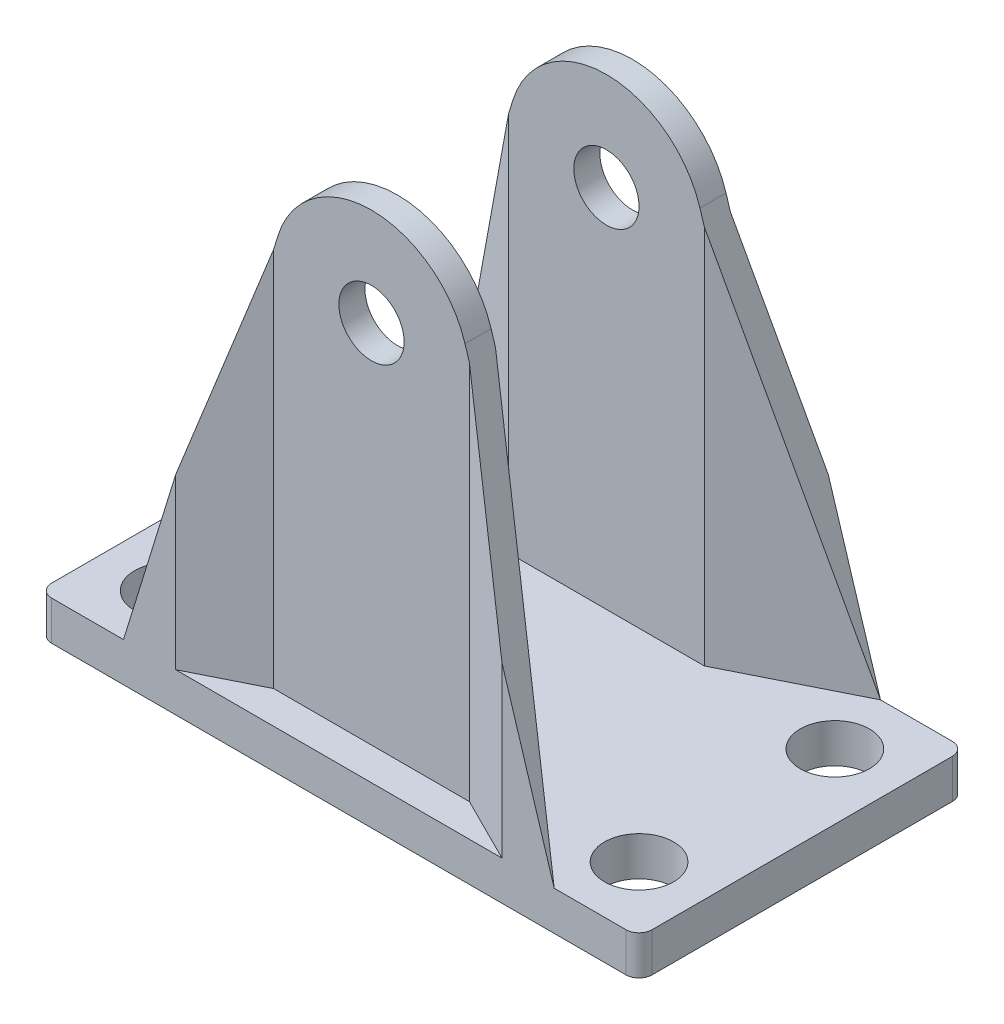
ISO-10303-21;
HEADER;
FILE_DESCRIPTION(('STEP AP214'),'2;1');
FILE_NAME('part.step','',(''),(''),'','','');
FILE_SCHEMA(('AUTOMOTIVE_DESIGN { 1 0 10303 214 1 1 1 1 }'));
ENDSEC;
DATA;
#1=APPLICATION_CONTEXT('core data for automotive mechanical design processes');
#2=APPLICATION_PROTOCOL_DEFINITION('international standard','automotive_design',2000,#1);
#3=PRODUCT_CONTEXT('',#1,'mechanical');
#4=PRODUCT('Part','Part','',(#3));
#5=PRODUCT_RELATED_PRODUCT_CATEGORY('part','',(#4));
#6=PRODUCT_DEFINITION_FORMATION('','',#4);
#7=PRODUCT_DEFINITION_CONTEXT('part definition',#1,'design');
#8=PRODUCT_DEFINITION('design','',#6,#7);
#9=PRODUCT_DEFINITION_SHAPE('','',#8);
#10=(LENGTH_UNIT() NAMED_UNIT(*) SI_UNIT(.MILLI.,.METRE.));
#11=(NAMED_UNIT(*) PLANE_ANGLE_UNIT() SI_UNIT($,.RADIAN.));
#12=(NAMED_UNIT(*) SI_UNIT($,.STERADIAN.) SOLID_ANGLE_UNIT());
#13=UNCERTAINTY_MEASURE_WITH_UNIT(LENGTH_MEASURE(1.E-05),#10,'distance_accuracy_value','');
#14=(GEOMETRIC_REPRESENTATION_CONTEXT(3) GLOBAL_UNCERTAINTY_ASSIGNED_CONTEXT((#13)) GLOBAL_UNIT_ASSIGNED_CONTEXT((#10,
#11,#12)) REPRESENTATION_CONTEXT('',''));
#15=CARTESIAN_POINT('',(0.,0.,0.));
#16=DIRECTION('',(0.,0.,1.));
#17=DIRECTION('',(1.,0.,0.));
#18=AXIS2_PLACEMENT_3D('',#15,#16,#17);
#19=CARTESIAN_POINT('',(-23.,1.5,-12.5));
#20=DIRECTION('',(0.,0.,1.));
#21=DIRECTION('',(1.,0.,0.));
#22=AXIS2_PLACEMENT_3D('',#19,#20,#21);
#23=PLANE('',#22);
#24=DIRECTION('',(-0.295172368215651,0.955444018790198,0.));
#25=VECTOR('',#24,1.);
#26=CARTESIAN_POINT('',(13.0584942851576,12.6398166120894,-12.5));
#27=LINE('',#26,#25);
#28=CARTESIAN_POINT('',(16.5,1.5,-12.5));
#29=VERTEX_POINT('',#28);
#30=CARTESIAN_POINT('',(12.5,14.4476078613449,-12.5));
#31=VERTEX_POINT('',#30);
#32=EDGE_CURVE('E438',#29,#31,#27,.T.);
#33=ORIENTED_EDGE('',*,*,#32,.F.);
#34=DIRECTION('',(-1.,0.,0.));
#35=VECTOR('',#34,1.);
#36=CARTESIAN_POINT('',(-23.,1.5,-12.5));
#37=LINE('',#36,#35);
#38=CARTESIAN_POINT('',(22.,1.5,-12.5));
#39=VERTEX_POINT('',#38);
#40=EDGE_CURVE('E263',#39,#29,#37,.T.);
#41=ORIENTED_EDGE('',*,*,#40,.F.);
#42=DIRECTION('',(0.,-1.,0.));
#43=VECTOR('',#42,1.);
#44=CARTESIAN_POINT('',(22.,1.5,-12.5));
#45=LINE('',#44,#43);
#46=CARTESIAN_POINT('',(22.,-1.5,-12.5));
#47=VERTEX_POINT('',#46);
#48=EDGE_CURVE('E348',#39,#47,#45,.T.);
#49=ORIENTED_EDGE('',*,*,#48,.T.);
#50=DIRECTION('',(-1.,0.,0.));
#51=VECTOR('',#50,1.);
#52=CARTESIAN_POINT('',(-23.,-1.5,-12.5));
#53=LINE('',#52,#51);
#54=CARTESIAN_POINT('',(-22.,-1.5,-12.5));
#55=VERTEX_POINT('',#54);
#56=EDGE_CURVE('E292',#47,#55,#53,.T.);
#57=ORIENTED_EDGE('',*,*,#56,.T.);
#58=DIRECTION('',(0.,-1.,0.));
#59=VECTOR('',#58,1.);
#60=CARTESIAN_POINT('',(-22.,1.5,-12.5));
#61=LINE('',#60,#59);
#62=CARTESIAN_POINT('',(-22.,1.5,-12.5));
#63=VERTEX_POINT('',#62);
#64=EDGE_CURVE('E257',#55,#63,#61,.F.);
#65=ORIENTED_EDGE('',*,*,#64,.T.);
#66=CARTESIAN_POINT('',(-16.5,1.5,-12.5));
#67=VERTEX_POINT('',#66);
#68=EDGE_CURVE('E246',#67,#63,#37,.T.);
#69=ORIENTED_EDGE('',*,*,#68,.F.);
#70=DIRECTION('',(0.295172368215653,0.955444018790197,0.));
#71=VECTOR('',#70,1.);
#72=CARTESIAN_POINT('',(-17.0663237252272,-0.333134379204587,-12.5));
#73=LINE('',#72,#71);
#74=CARTESIAN_POINT('',(-12.5,14.447607861345,-12.5));
#75=VERTEX_POINT('',#74);
#76=EDGE_CURVE('E221',#67,#75,#73,.T.);
#77=ORIENTED_EDGE('',*,*,#76,.T.);
#78=DIRECTION('',(0.,-1.,0.));
#79=VECTOR('',#78,1.);
#80=CARTESIAN_POINT('',(-12.5,51.5,-12.5));
#81=LINE('',#80,#79);
#82=CARTESIAN_POINT('',(-12.5,1.5,-12.5));
#83=VERTEX_POINT('',#82);
#84=EDGE_CURVE('E505',#75,#83,#81,.T.);
#85=ORIENTED_EDGE('',*,*,#84,.T.);
#86=CARTESIAN_POINT('',(12.5,1.5,-12.5));
#87=VERTEX_POINT('',#86);
#88=EDGE_CURVE('E260',#87,#83,#37,.T.);
#89=ORIENTED_EDGE('',*,*,#88,.F.);
#90=DIRECTION('',(0.,-1.,0.));
#91=VECTOR('',#90,1.);
#92=CARTESIAN_POINT('',(12.5,51.5,-12.5));
#93=LINE('',#92,#91);
#94=EDGE_CURVE('E514',#31,#87,#93,.T.);
#95=ORIENTED_EDGE('',*,*,#94,.F.);
#96=EDGE_LOOP('',(#33,#41,#49,#57,#65,#69,#77,#85,#89,#95));
#97=FACE_BOUND('',#96,.T.);
#98=ADVANCED_FACE('F47',(#97),#23,.F.);
#99=CARTESIAN_POINT('',(-23.,1.5,12.5));
#100=DIRECTION('',(0.,0.,-1.));
#101=DIRECTION('',(-1.,0.,0.));
#102=AXIS2_PLACEMENT_3D('',#99,#100,#101);
#103=PLANE('',#102);
#104=DIRECTION('',(0.295172368215651,-0.955444018790198,0.));
#105=VECTOR('',#104,1.);
#106=CARTESIAN_POINT('',(13.0584942851576,12.6398166120894,12.5));
#107=LINE('',#106,#105);
#108=CARTESIAN_POINT('',(12.5,14.447607861345,12.5));
#109=VERTEX_POINT('',#108);
#110=CARTESIAN_POINT('',(16.5,1.5,12.5));
#111=VERTEX_POINT('',#110);
#112=EDGE_CURVE('E421',#109,#111,#107,.T.);
#113=ORIENTED_EDGE('',*,*,#112,.F.);
#114=DIRECTION('',(0.,-1.,0.));
#115=VECTOR('',#114,1.);
#116=CARTESIAN_POINT('',(12.5,51.5,12.5));
#117=LINE('',#116,#115);
#118=CARTESIAN_POINT('',(12.5,1.5,12.5));
#119=VERTEX_POINT('',#118);
#120=EDGE_CURVE('E477',#109,#119,#117,.T.);
#121=ORIENTED_EDGE('',*,*,#120,.T.);
#122=DIRECTION('',(1.,0.,0.));
#123=VECTOR('',#122,1.);
#124=CARTESIAN_POINT('',(-23.,1.5,12.5));
#125=LINE('',#124,#123);
#126=CARTESIAN_POINT('',(-12.5,1.5,12.5));
#127=VERTEX_POINT('',#126);
#128=EDGE_CURVE('E282',#127,#119,#125,.T.);
#129=ORIENTED_EDGE('',*,*,#128,.F.);
#130=DIRECTION('',(0.,-1.,0.));
#131=VECTOR('',#130,1.);
#132=CARTESIAN_POINT('',(-12.5,51.5,12.5));
#133=LINE('',#132,#131);
#134=CARTESIAN_POINT('',(-12.5,14.447607861345,12.5));
#135=VERTEX_POINT('',#134);
#136=EDGE_CURVE('E252',#135,#127,#133,.T.);
#137=ORIENTED_EDGE('',*,*,#136,.F.);
#138=DIRECTION('',(-0.295172368215653,-0.955444018790197,0.));
#139=VECTOR('',#138,1.);
#140=CARTESIAN_POINT('',(-17.0663237252272,-0.333134379204587,12.5));
#141=LINE('',#140,#139);
#142=CARTESIAN_POINT('',(-16.5,1.5,12.5));
#143=VERTEX_POINT('',#142);
#144=EDGE_CURVE('E391',#135,#143,#141,.T.);
#145=ORIENTED_EDGE('',*,*,#144,.T.);
#146=CARTESIAN_POINT('',(-22.,1.5,12.5));
#147=VERTEX_POINT('',#146);
#148=EDGE_CURVE('E284',#147,#143,#125,.T.);
#149=ORIENTED_EDGE('',*,*,#148,.F.);
#150=DIRECTION('',(0.,-1.,0.));
#151=VECTOR('',#150,1.);
#152=CARTESIAN_POINT('',(-22.,1.5,12.5));
#153=LINE('',#152,#151);
#154=CARTESIAN_POINT('',(-22.,-1.5,12.5));
#155=VERTEX_POINT('',#154);
#156=EDGE_CURVE('E321',#147,#155,#153,.T.);
#157=ORIENTED_EDGE('',*,*,#156,.T.);
#158=DIRECTION('',(1.,0.,0.));
#159=VECTOR('',#158,1.);
#160=CARTESIAN_POINT('',(-23.,-1.5,12.5));
#161=LINE('',#160,#159);
#162=CARTESIAN_POINT('',(22.,-1.5,12.5));
#163=VERTEX_POINT('',#162);
#164=EDGE_CURVE('E268',#155,#163,#161,.T.);
#165=ORIENTED_EDGE('',*,*,#164,.T.);
#166=DIRECTION('',(0.,-1.,0.));
#167=VECTOR('',#166,1.);
#168=CARTESIAN_POINT('',(22.,1.5,12.5));
#169=LINE('',#168,#167);
#170=CARTESIAN_POINT('',(22.,1.5,12.5));
#171=VERTEX_POINT('',#170);
#172=EDGE_CURVE('E325',#163,#171,#169,.F.);
#173=ORIENTED_EDGE('',*,*,#172,.T.);
#174=EDGE_CURVE('E278',#111,#171,#125,.T.);
#175=ORIENTED_EDGE('',*,*,#174,.F.);
#176=EDGE_LOOP('',(#113,#121,#129,#137,#145,#149,#157,#165,#173,#175));
#177=FACE_BOUND('',#176,.T.);
#178=ADVANCED_FACE('F576',(#177),#103,.F.);
#179=CARTESIAN_POINT('',(0.,51.5,-8.));
#180=DIRECTION('',(0.,0.,-1.));
#181=DIRECTION('',(-1.,0.,0.));
#182=AXIS2_PLACEMENT_3D('',#179,#180,#181);
#183=PLANE('',#182);
#184=CARTESIAN_POINT('',(0.,29.5,-8.));
#185=DIRECTION('',(0.,0.,-1.));
#186=DIRECTION('',(-1.,0.,0.));
#187=AXIS2_PLACEMENT_3D('',#184,#185,#186);
#188=CIRCLE('',#187,2.5);
#189=CARTESIAN_POINT('',(-2.5,29.5,-8.));
#190=VERTEX_POINT('',#189);
#191=EDGE_CURVE('E384',#190,#190,#188,.T.);
#192=ORIENTED_EDGE('',*,*,#191,.T.);
#193=EDGE_LOOP('',(#192));
#194=FACE_BOUND('',#193,.T.);
#195=DIRECTION('',(0.295172368215651,-0.955444018790198,0.));
#196=VECTOR('',#195,1.);
#197=CARTESIAN_POINT('',(0.96137531900328,51.7970047685406,-8.));
#198=LINE('',#197,#196);
#199=CARTESIAN_POINT('',(7.16583014092648,31.7137927616174,-8.));
#200=VERTEX_POINT('',#199);
#201=CARTESIAN_POINT('',(7.5,30.6321176880262,-8.));
#202=VERTEX_POINT('',#201);
#203=EDGE_CURVE('E444',#200,#202,#198,.T.);
#204=ORIENTED_EDGE('',*,*,#203,.F.);
#205=CARTESIAN_POINT('',(0.,29.5,-8.));
#206=DIRECTION('',(0.,0.,-1.));
#207=DIRECTION('',(-1.,0.,0.));
#208=AXIS2_PLACEMENT_3D('',#205,#206,#207);
#209=CIRCLE('',#208,7.5);
#210=CARTESIAN_POINT('',(-7.16583014092648,31.7137927616174,-8.));
#211=VERTEX_POINT('',#210);
#212=EDGE_CURVE('E414',#211,#200,#209,.T.);
#213=ORIENTED_EDGE('',*,*,#212,.F.);
#214=DIRECTION('',(-0.295172368215653,-0.955444018790197,0.));
#215=VECTOR('',#214,1.);
#216=CARTESIAN_POINT('',(-0.96137531900325,51.7970047685406,-8.));
#217=LINE('',#216,#215);
#218=CARTESIAN_POINT('',(-7.5,30.6321176880262,-8.));
#219=VERTEX_POINT('',#218);
#220=EDGE_CURVE('E240',#211,#219,#217,.T.);
#221=ORIENTED_EDGE('',*,*,#220,.T.);
#222=DIRECTION('',(0.,-1.,0.));
#223=VECTOR('',#222,1.);
#224=CARTESIAN_POINT('',(-7.5,51.5,-8.));
#225=LINE('',#224,#223);
#226=CARTESIAN_POINT('',(-7.5,1.5,-8.));
#227=VERTEX_POINT('',#226);
#228=EDGE_CURVE('E238',#219,#227,#225,.T.);
#229=ORIENTED_EDGE('',*,*,#228,.T.);
#230=DIRECTION('',(1.,0.,0.));
#231=VECTOR('',#230,1.);
#232=CARTESIAN_POINT('',(0.,1.5,-8.));
#233=LINE('',#232,#231);
#234=CARTESIAN_POINT('',(7.5,1.5,-8.));
#235=VERTEX_POINT('',#234);
#236=EDGE_CURVE('E250',#227,#235,#233,.T.);
#237=ORIENTED_EDGE('',*,*,#236,.T.);
#238=DIRECTION('',(0.,-1.,0.));
#239=VECTOR('',#238,1.);
#240=CARTESIAN_POINT('',(7.5,51.5,-8.));
#241=LINE('',#240,#239);
#242=EDGE_CURVE('E517',#202,#235,#241,.T.);
#243=ORIENTED_EDGE('',*,*,#242,.F.);
#244=EDGE_LOOP('',(#204,#213,#221,#229,#237,#243));
#245=FACE_BOUND('',#244,.T.);
#246=ADVANCED_FACE('F582',(#194,#245),#183,.F.);
#247=CARTESIAN_POINT('',(-1.7,51.5,-3.4));
#248=DIRECTION('',(-0.447213595499958,0.,-0.894427190999916));
#249=DIRECTION('',(-0.894427190999916,0.,0.447213595499958));
#250=AXIS2_PLACEMENT_3D('',#247,#248,#249);
#251=PLANE('',#250);
#252=DIRECTION('',(0.292009273283408,-0.945205390587474,-0.146004636641704));
#253=VECTOR('',#252,1.);
#254=CARTESIAN_POINT('',(0.759683832749848,52.4498603367859,-4.62984191637492));
#255=LINE('',#254,#253);
#256=EDGE_CURVE('E441',#202,#29,#255,.T.);
#257=ORIENTED_EDGE('',*,*,#256,.F.);
#258=ORIENTED_EDGE('',*,*,#242,.T.);
#259=DIRECTION('',(0.894427190999916,0.,-0.447213595499958));
#260=VECTOR('',#259,1.);
#261=CARTESIAN_POINT('',(-1.7,1.5,-3.4));
#262=LINE('',#261,#260);
#263=EDGE_CURVE('E490',#235,#29,#262,.T.);
#264=ORIENTED_EDGE('',*,*,#263,.T.);
#265=EDGE_LOOP('',(#257,#258,#264));
#266=FACE_BOUND('',#265,.T.);
#267=ADVANCED_FACE('F635',(#266),#251,.F.);
#268=CARTESIAN_POINT('',(-2.5,51.5,-5.));
#269=DIRECTION('',(-0.447213595499958,0.,-0.894427190999916));
#270=DIRECTION('',(-0.894427190999916,0.,0.447213595499958));
#271=AXIS2_PLACEMENT_3D('',#268,#269,#270);
#272=PLANE('',#271);
#273=DIRECTION('',(0.,-1.,0.));
#274=VECTOR('',#273,1.);
#275=CARTESIAN_POINT('',(7.5,51.5,-10.));
#276=LINE('',#275,#274);
#277=CARTESIAN_POINT('',(7.5,30.6321176880262,-10.));
#278=VERTEX_POINT('',#277);
#279=CARTESIAN_POINT('',(7.5,1.5,-10.));
#280=VERTEX_POINT('',#279);
#281=EDGE_CURVE('E511',#278,#280,#276,.T.);
#282=ORIENTED_EDGE('',*,*,#281,.F.);
#283=DIRECTION('',(0.292009273283408,-0.945205390587474,-0.146004636641704));
#284=VECTOR('',#283,1.);
#285=CARTESIAN_POINT('',(0.674414417066342,52.7258690759949,-6.58720720853317));
#286=LINE('',#285,#284);
#287=EDGE_CURVE('E434',#278,#31,#286,.T.);
#288=ORIENTED_EDGE('',*,*,#287,.T.);
#289=ORIENTED_EDGE('',*,*,#94,.T.);
#290=DIRECTION('',(0.894427190999916,0.,-0.447213595499958));
#291=VECTOR('',#290,1.);
#292=CARTESIAN_POINT('',(-2.5,1.5,-5.));
#293=LINE('',#292,#291);
#294=EDGE_CURVE('E493',#280,#87,#293,.T.);
#295=ORIENTED_EDGE('',*,*,#294,.F.);
#296=EDGE_LOOP('',(#282,#288,#289,#295));
#297=FACE_BOUND('',#296,.T.);
#298=ADVANCED_FACE('F616',(#297),#272,.T.);
#299=CARTESIAN_POINT('',(0.,51.5,-10.));
#300=DIRECTION('',(0.,0.,-1.));
#301=DIRECTION('',(-1.,0.,0.));
#302=AXIS2_PLACEMENT_3D('',#299,#300,#301);
#303=PLANE('',#302);
#304=CARTESIAN_POINT('',(0.,29.5,-10.));
#305=DIRECTION('',(0.,0.,-1.));
#306=DIRECTION('',(-1.,0.,0.));
#307=AXIS2_PLACEMENT_3D('',#304,#305,#306);
#308=CIRCLE('',#307,2.5);
#309=CARTESIAN_POINT('',(-2.5,29.5,-10.));
#310=VERTEX_POINT('',#309);
#311=EDGE_CURVE('E723',#310,#310,#308,.T.);
#312=ORIENTED_EDGE('',*,*,#311,.F.);
#313=EDGE_LOOP('',(#312));
#314=FACE_BOUND('',#313,.T.);
#315=CARTESIAN_POINT('',(0.,29.5,-10.));
#316=DIRECTION('',(0.,0.,-1.));
#317=DIRECTION('',(-1.,0.,0.));
#318=AXIS2_PLACEMENT_3D('',#315,#316,#317);
#319=CIRCLE('',#318,7.5);
#320=CARTESIAN_POINT('',(-7.16583014092648,31.7137927616174,-10.));
#321=VERTEX_POINT('',#320);
#322=CARTESIAN_POINT('',(7.16583014092648,31.7137927616174,-10.));
#323=VERTEX_POINT('',#322);
#324=EDGE_CURVE('E410',#321,#323,#319,.T.);
#325=ORIENTED_EDGE('',*,*,#324,.T.);
#326=DIRECTION('',(0.295172368215651,-0.955444018790198,0.));
#327=VECTOR('',#326,1.);
#328=CARTESIAN_POINT('',(0.96137531900328,51.7970047685406,-10.));
#329=LINE('',#328,#327);
#330=EDGE_CURVE('E430',#323,#278,#329,.T.);
#331=ORIENTED_EDGE('',*,*,#330,.T.);
#332=ORIENTED_EDGE('',*,*,#281,.T.);
#333=DIRECTION('',(1.,0.,0.));
#334=VECTOR('',#333,1.);
#335=CARTESIAN_POINT('',(0.,1.5,-10.));
#336=LINE('',#335,#334);
#337=CARTESIAN_POINT('',(-7.5,1.5,-10.));
#338=VERTEX_POINT('',#337);
#339=EDGE_CURVE('E497',#338,#280,#336,.T.);
#340=ORIENTED_EDGE('',*,*,#339,.F.);
#341=DIRECTION('',(0.,-1.,0.));
#342=VECTOR('',#341,1.);
#343=CARTESIAN_POINT('',(-7.5,51.5,-10.));
#344=LINE('',#343,#342);
#345=CARTESIAN_POINT('',(-7.5,30.6321176880262,-10.));
#346=VERTEX_POINT('',#345);
#347=EDGE_CURVE('E508',#346,#338,#344,.T.);
#348=ORIENTED_EDGE('',*,*,#347,.F.);
#349=DIRECTION('',(-0.295172368215653,-0.955444018790197,0.));
#350=VECTOR('',#349,1.);
#351=CARTESIAN_POINT('',(-0.96137531900325,51.7970047685406,-10.));
#352=LINE('',#351,#350);
#353=EDGE_CURVE('E64',#321,#346,#352,.T.);
#354=ORIENTED_EDGE('',*,*,#353,.F.);
#355=EDGE_LOOP('',(#325,#331,#332,#340,#348,#354));
#356=FACE_BOUND('',#355,.T.);
#357=ADVANCED_FACE('F620',(#314,#356),#303,.T.);
#358=CARTESIAN_POINT('',(0.,51.5,10.));
#359=DIRECTION('',(0.,0.,-1.));
#360=DIRECTION('',(-1.,0.,0.));
#361=AXIS2_PLACEMENT_3D('',#358,#359,#360);
#362=PLANE('',#361);
#363=CARTESIAN_POINT('',(0.,29.5,10.));
#364=DIRECTION('',(0.,0.,-1.));
#365=DIRECTION('',(-1.,0.,0.));
#366=AXIS2_PLACEMENT_3D('',#363,#364,#365);
#367=CIRCLE('',#366,2.5);
#368=CARTESIAN_POINT('',(-2.5,29.5,10.));
#369=VERTEX_POINT('',#368);
#370=EDGE_CURVE('E726',#369,#369,#367,.T.);
#371=ORIENTED_EDGE('',*,*,#370,.T.);
#372=EDGE_LOOP('',(#371));
#373=FACE_BOUND('',#372,.T.);
#374=DIRECTION('',(0.295172368215651,-0.955444018790198,0.));
#375=VECTOR('',#374,1.);
#376=CARTESIAN_POINT('',(0.96137531900328,51.7970047685406,10.));
#377=LINE('',#376,#375);
#378=CARTESIAN_POINT('',(7.16583014092648,31.7137927616174,10.));
#379=VERTEX_POINT('',#378);
#380=CARTESIAN_POINT('',(7.5,30.6321176880262,10.));
#381=VERTEX_POINT('',#380);
#382=EDGE_CURVE('E427',#379,#381,#377,.T.);
#383=ORIENTED_EDGE('',*,*,#382,.F.);
#384=CARTESIAN_POINT('',(0.,29.5,10.));
#385=DIRECTION('',(0.,0.,-1.));
#386=DIRECTION('',(-1.,0.,0.));
#387=AXIS2_PLACEMENT_3D('',#384,#385,#386);
#388=CIRCLE('',#387,7.5);
#389=CARTESIAN_POINT('',(-7.16583014092648,31.7137927616174,10.));
#390=VERTEX_POINT('',#389);
#391=EDGE_CURVE('E370',#390,#379,#388,.T.);
#392=ORIENTED_EDGE('',*,*,#391,.F.);
#393=DIRECTION('',(-0.295172368215653,-0.955444018790197,0.));
#394=VECTOR('',#393,1.);
#395=CARTESIAN_POINT('',(-0.96137531900325,51.7970047685406,10.));
#396=LINE('',#395,#394);
#397=CARTESIAN_POINT('',(-7.5,30.6321176880262,10.));
#398=VERTEX_POINT('',#397);
#399=EDGE_CURVE('E398',#390,#398,#396,.T.);
#400=ORIENTED_EDGE('',*,*,#399,.T.);
#401=DIRECTION('',(0.,-1.,0.));
#402=VECTOR('',#401,1.);
#403=CARTESIAN_POINT('',(-7.5,51.5,10.));
#404=LINE('',#403,#402);
#405=CARTESIAN_POINT('',(-7.5,1.5,10.));
#406=VERTEX_POINT('',#405);
#407=EDGE_CURVE('E483',#398,#406,#404,.T.);
#408=ORIENTED_EDGE('',*,*,#407,.T.);
#409=DIRECTION('',(1.,0.,0.));
#410=VECTOR('',#409,1.);
#411=CARTESIAN_POINT('',(0.,1.5,10.));
#412=LINE('',#411,#410);
#413=CARTESIAN_POINT('',(7.5,1.5,10.));
#414=VERTEX_POINT('',#413);
#415=EDGE_CURVE('E455',#406,#414,#412,.T.);
#416=ORIENTED_EDGE('',*,*,#415,.T.);
#417=DIRECTION('',(0.,-1.,0.));
#418=VECTOR('',#417,1.);
#419=CARTESIAN_POINT('',(7.5,51.5,10.));
#420=LINE('',#419,#418);
#421=EDGE_CURVE('E480',#381,#414,#420,.T.);
#422=ORIENTED_EDGE('',*,*,#421,.F.);
#423=EDGE_LOOP('',(#383,#392,#400,#408,#416,#422));
#424=FACE_BOUND('',#423,.T.);
#425=ADVANCED_FACE('F703',(#373,#424),#362,.F.);
#426=CARTESIAN_POINT('',(-2.5,51.5,5.));
#427=DIRECTION('',(0.447213595499958,0.,-0.894427190999916));
#428=DIRECTION('',(-0.894427190999916,0.,-0.447213595499958));
#429=AXIS2_PLACEMENT_3D('',#426,#427,#428);
#430=PLANE('',#429);
#431=DIRECTION('',(0.292009273283408,-0.945205390587474,0.146004636641704));
#432=VECTOR('',#431,1.);
#433=CARTESIAN_POINT('',(0.674414417066342,52.7258690759949,6.58720720853317));
#434=LINE('',#433,#432);
#435=EDGE_CURVE('E424',#381,#109,#434,.T.);
#436=ORIENTED_EDGE('',*,*,#435,.F.);
#437=ORIENTED_EDGE('',*,*,#421,.T.);
#438=DIRECTION('',(0.894427190999916,0.,0.447213595499958));
#439=VECTOR('',#438,1.);
#440=CARTESIAN_POINT('',(-2.5,1.5,5.));
#441=LINE('',#440,#439);
#442=EDGE_CURVE('E459',#414,#119,#441,.T.);
#443=ORIENTED_EDGE('',*,*,#442,.T.);
#444=ORIENTED_EDGE('',*,*,#120,.F.);
#445=EDGE_LOOP('',(#436,#437,#443,#444));
#446=FACE_BOUND('',#445,.T.);
#447=ADVANCED_FACE('F694',(#446),#430,.F.);
#448=CARTESIAN_POINT('',(-1.7,51.5,3.4));
#449=DIRECTION('',(0.447213595499958,0.,-0.894427190999916));
#450=DIRECTION('',(-0.894427190999916,0.,-0.447213595499958));
#451=AXIS2_PLACEMENT_3D('',#448,#449,#450);
#452=PLANE('',#451);
#453=DIRECTION('',(0.,-1.,0.));
#454=VECTOR('',#453,1.);
#455=CARTESIAN_POINT('',(7.5,51.5,8.));
#456=LINE('',#455,#454);
#457=CARTESIAN_POINT('',(7.5,30.6321176880262,8.));
#458=VERTEX_POINT('',#457);
#459=CARTESIAN_POINT('',(7.5,1.5,8.));
#460=VERTEX_POINT('',#459);
#461=EDGE_CURVE('E474',#458,#460,#456,.T.);
#462=ORIENTED_EDGE('',*,*,#461,.F.);
#463=DIRECTION('',(0.292009273283408,-0.945205390587474,0.146004636641704));
#464=VECTOR('',#463,1.);
#465=CARTESIAN_POINT('',(0.759683832749848,52.4498603367859,4.62984191637492));
#466=LINE('',#465,#464);
#467=EDGE_CURVE('E417',#458,#111,#466,.T.);
#468=ORIENTED_EDGE('',*,*,#467,.T.);
#469=DIRECTION('',(0.894427190999916,0.,0.447213595499958));
#470=VECTOR('',#469,1.);
#471=CARTESIAN_POINT('',(-1.7,1.5,3.4));
#472=LINE('',#471,#470);
#473=EDGE_CURVE('E463',#460,#111,#472,.T.);
#474=ORIENTED_EDGE('',*,*,#473,.F.);
#475=EDGE_LOOP('',(#462,#468,#474));
#476=FACE_BOUND('',#475,.T.);
#477=ADVANCED_FACE('F675',(#476),#452,.T.);
#478=CARTESIAN_POINT('',(0.,51.5,8.));
#479=DIRECTION('',(0.,0.,-1.));
#480=DIRECTION('',(-1.,0.,0.));
#481=AXIS2_PLACEMENT_3D('',#478,#479,#480);
#482=PLANE('',#481);
#483=CARTESIAN_POINT('',(0.,29.5,8.));
#484=DIRECTION('',(0.,0.,-1.));
#485=DIRECTION('',(-1.,0.,0.));
#486=AXIS2_PLACEMENT_3D('',#483,#484,#485);
#487=CIRCLE('',#486,2.5);
#488=CARTESIAN_POINT('',(-2.5,29.5,8.));
#489=VERTEX_POINT('',#488);
#490=EDGE_CURVE('E51',#489,#489,#487,.T.);
#491=ORIENTED_EDGE('',*,*,#490,.F.);
#492=EDGE_LOOP('',(#491));
#493=FACE_BOUND('',#492,.T.);
#494=CARTESIAN_POINT('',(0.,29.5,8.));
#495=DIRECTION('',(0.,0.,-1.));
#496=DIRECTION('',(-1.,0.,0.));
#497=AXIS2_PLACEMENT_3D('',#494,#495,#496);
#498=CIRCLE('',#497,7.5);
#499=CARTESIAN_POINT('',(-7.16583014092648,31.7137927616174,8.));
#500=VERTEX_POINT('',#499);
#501=CARTESIAN_POINT('',(7.16583014092648,31.7137927616174,8.));
#502=VERTEX_POINT('',#501);
#503=EDGE_CURVE('E57',#500,#502,#498,.T.);
#504=ORIENTED_EDGE('',*,*,#503,.T.);
#505=DIRECTION('',(0.295172368215651,-0.955444018790198,0.));
#506=VECTOR('',#505,1.);
#507=CARTESIAN_POINT('',(0.96137531900328,51.7970047685406,8.));
#508=LINE('',#507,#506);
#509=EDGE_CURVE('E11',#502,#458,#508,.T.);
#510=ORIENTED_EDGE('',*,*,#509,.T.);
#511=ORIENTED_EDGE('',*,*,#461,.T.);
#512=DIRECTION('',(1.,0.,0.));
#513=VECTOR('',#512,1.);
#514=CARTESIAN_POINT('',(0.,1.5,8.));
#515=LINE('',#514,#513);
#516=CARTESIAN_POINT('',(-7.5,1.5,8.));
#517=VERTEX_POINT('',#516);
#518=EDGE_CURVE('E467',#517,#460,#515,.T.);
#519=ORIENTED_EDGE('',*,*,#518,.F.);
#520=DIRECTION('',(0.,-1.,0.));
#521=VECTOR('',#520,1.);
#522=CARTESIAN_POINT('',(-7.5,51.5,8.));
#523=LINE('',#522,#521);
#524=CARTESIAN_POINT('',(-7.5,30.6321176880262,8.));
#525=VERTEX_POINT('',#524);
#526=EDGE_CURVE('E471',#525,#517,#523,.T.);
#527=ORIENTED_EDGE('',*,*,#526,.F.);
#528=DIRECTION('',(-0.295172368215653,-0.955444018790197,0.));
#529=VECTOR('',#528,1.);
#530=CARTESIAN_POINT('',(-0.96137531900325,51.7970047685406,8.));
#531=LINE('',#530,#529);
#532=EDGE_CURVE('E354',#500,#525,#531,.T.);
#533=ORIENTED_EDGE('',*,*,#532,.F.);
#534=EDGE_LOOP('',(#504,#510,#511,#519,#527,#533));
#535=FACE_BOUND('',#534,.T.);
#536=ADVANCED_FACE('F361',(#493,#535),#482,.T.);
#537=CARTESIAN_POINT('',(0.,1.5,0.));
#538=DIRECTION('',(0.,-1.,0.));
#539=DIRECTION('',(0.,0.,-1.));
#540=AXIS2_PLACEMENT_3D('',#537,#538,#539);
#541=PLANE('',#540);
#542=CARTESIAN_POINT('',(18.,1.5,-7.5));
#543=DIRECTION('',(0.,1.,0.));
#544=DIRECTION('',(0.,0.,1.));
#545=AXIS2_PLACEMENT_3D('',#542,#543,#544);
#546=CIRCLE('',#545,2.65);
#547=CARTESIAN_POINT('',(18.,1.5,-4.85));
#548=VERTEX_POINT('',#547);
#549=EDGE_CURVE('E539',#548,#548,#546,.T.);
#550=ORIENTED_EDGE('',*,*,#549,.F.);
#551=EDGE_LOOP('',(#550));
#552=FACE_BOUND('',#551,.T.);
#553=CARTESIAN_POINT('',(18.,1.5,7.5));
#554=DIRECTION('',(0.,1.,0.));
#555=DIRECTION('',(0.,0.,1.));
#556=AXIS2_PLACEMENT_3D('',#553,#554,#555);
#557=CIRCLE('',#556,2.65);
#558=CARTESIAN_POINT('',(18.,1.5,10.15));
#559=VERTEX_POINT('',#558);
#560=EDGE_CURVE('E523',#559,#559,#557,.T.);
#561=ORIENTED_EDGE('',*,*,#560,.F.);
#562=EDGE_LOOP('',(#561));
#563=FACE_BOUND('',#562,.T.);
#564=CARTESIAN_POINT('',(-18.,1.5,7.5));
#565=DIRECTION('',(0.,1.,0.));
#566=DIRECTION('',(0.,0.,1.));
#567=AXIS2_PLACEMENT_3D('',#564,#565,#566);
#568=CIRCLE('',#567,2.65);
#569=CARTESIAN_POINT('',(-18.,1.5,10.15));
#570=VERTEX_POINT('',#569);
#571=EDGE_CURVE('E531',#570,#570,#568,.T.);
#572=ORIENTED_EDGE('',*,*,#571,.F.);
#573=EDGE_LOOP('',(#572));
#574=FACE_BOUND('',#573,.T.);
#575=CARTESIAN_POINT('',(-18.,1.5,-7.5));
#576=DIRECTION('',(0.,1.,0.));
#577=DIRECTION('',(0.,0.,1.));
#578=AXIS2_PLACEMENT_3D('',#575,#576,#577);
#579=CIRCLE('',#578,2.65);
#580=CARTESIAN_POINT('',(-18.,1.5,-4.85));
#581=VERTEX_POINT('',#580);
#582=EDGE_CURVE('E293',#581,#581,#579,.T.);
#583=ORIENTED_EDGE('',*,*,#582,.F.);
#584=EDGE_LOOP('',(#583));
#585=FACE_BOUND('',#584,.T.);
#586=ORIENTED_EDGE('',*,*,#148,.T.);
#587=DIRECTION('',(-0.894427190999916,0.,0.447213595499958));
#588=VECTOR('',#587,1.);
#589=CARTESIAN_POINT('',(1.7,1.5,3.4));
#590=LINE('',#589,#588);
#591=EDGE_CURVE('E447',#517,#143,#590,.T.);
#592=ORIENTED_EDGE('',*,*,#591,.F.);
#593=ORIENTED_EDGE('',*,*,#518,.T.);
#594=ORIENTED_EDGE('',*,*,#473,.T.);
#595=ORIENTED_EDGE('',*,*,#174,.T.);
#596=CARTESIAN_POINT('',(22.,1.5,11.5));
#597=DIRECTION('',(0.,-1.,0.));
#598=DIRECTION('',(0.,0.,-1.));
#599=AXIS2_PLACEMENT_3D('',#596,#597,#598);
#600=CIRCLE('',#599,1.);
#601=CARTESIAN_POINT('',(23.,1.5,11.5));
#602=VERTEX_POINT('',#601);
#603=EDGE_CURVE('E338',#171,#602,#600,.F.);
#604=ORIENTED_EDGE('',*,*,#603,.T.);
#605=DIRECTION('',(0.,0.,-1.));
#606=VECTOR('',#605,1.);
#607=CARTESIAN_POINT('',(23.,1.5,12.5));
#608=LINE('',#607,#606);
#609=CARTESIAN_POINT('',(23.,1.5,-11.5));
#610=VERTEX_POINT('',#609);
#611=EDGE_CURVE('E261',#602,#610,#608,.T.);
#612=ORIENTED_EDGE('',*,*,#611,.T.);
#613=CARTESIAN_POINT('',(22.,1.5,-11.5));
#614=DIRECTION('',(0.,-1.,0.));
#615=DIRECTION('',(0.,0.,-1.));
#616=AXIS2_PLACEMENT_3D('',#613,#614,#615);
#617=CIRCLE('',#616,1.);
#618=EDGE_CURVE('E332',#610,#39,#617,.F.);
#619=ORIENTED_EDGE('',*,*,#618,.T.);
#620=ORIENTED_EDGE('',*,*,#40,.T.);
#621=ORIENTED_EDGE('',*,*,#263,.F.);
#622=ORIENTED_EDGE('',*,*,#236,.F.);
#623=DIRECTION('',(-0.894427190999916,0.,-0.447213595499958));
#624=VECTOR('',#623,1.);
#625=CARTESIAN_POINT('',(1.7,1.5,-3.4));
#626=LINE('',#625,#624);
#627=EDGE_CURVE('E237',#227,#67,#626,.T.);
#628=ORIENTED_EDGE('',*,*,#627,.T.);
#629=ORIENTED_EDGE('',*,*,#68,.T.);
#630=CARTESIAN_POINT('',(-22.,1.5,-11.5));
#631=DIRECTION('',(0.,-1.,0.));
#632=DIRECTION('',(0.,0.,-1.));
#633=AXIS2_PLACEMENT_3D('',#630,#631,#632);
#634=CIRCLE('',#633,1.);
#635=CARTESIAN_POINT('',(-23.,1.5,-11.5));
#636=VERTEX_POINT('',#635);
#637=EDGE_CURVE('E335',#63,#636,#634,.F.);
#638=ORIENTED_EDGE('',*,*,#637,.T.);
#639=DIRECTION('',(0.,0.,1.));
#640=VECTOR('',#639,1.);
#641=CARTESIAN_POINT('',(-23.,1.5,12.5));
#642=LINE('',#641,#640);
#643=CARTESIAN_POINT('',(-23.,1.5,11.5));
#644=VERTEX_POINT('',#643);
#645=EDGE_CURVE('E273',#636,#644,#642,.T.);
#646=ORIENTED_EDGE('',*,*,#645,.T.);
#647=CARTESIAN_POINT('',(-22.,1.5,11.5));
#648=DIRECTION('',(0.,-1.,0.));
#649=DIRECTION('',(0.,0.,-1.));
#650=AXIS2_PLACEMENT_3D('',#647,#648,#649);
#651=CIRCLE('',#650,1.);
#652=EDGE_CURVE('E329',#644,#147,#651,.F.);
#653=ORIENTED_EDGE('',*,*,#652,.T.);
#654=EDGE_LOOP('',(#586,#592,#593,#594,#595,#604,#612,#619,#620,#621,#622,#628,#629,#638,#646,#653));
#655=FACE_BOUND('',#654,.T.);
#656=ADVANCED_FACE('F245',(#552,#563,#574,#585,#655),#541,.F.);
#657=DIRECTION('',(-0.894427190999916,0.,-0.447213595499958));
#658=VECTOR('',#657,1.);
#659=CARTESIAN_POINT('',(2.5,1.5,-5.));
#660=LINE('',#659,#658);
#661=EDGE_CURVE('E501',#338,#83,#660,.T.);
#662=ORIENTED_EDGE('',*,*,#661,.F.);
#663=ORIENTED_EDGE('',*,*,#339,.T.);
#664=ORIENTED_EDGE('',*,*,#294,.T.);
#665=ORIENTED_EDGE('',*,*,#88,.T.);
#666=EDGE_LOOP('',(#662,#663,#664,#665));
#667=FACE_BOUND('',#666,.T.);
#668=ADVANCED_FACE('F624',(#667),#541,.F.);
#669=ORIENTED_EDGE('',*,*,#415,.F.);
#670=DIRECTION('',(-0.894427190999916,0.,0.447213595499958));
#671=VECTOR('',#670,1.);
#672=CARTESIAN_POINT('',(2.5,1.5,5.));
#673=LINE('',#672,#671);
#674=EDGE_CURVE('E451',#406,#127,#673,.T.);
#675=ORIENTED_EDGE('',*,*,#674,.T.);
#676=ORIENTED_EDGE('',*,*,#128,.T.);
#677=ORIENTED_EDGE('',*,*,#442,.F.);
#678=EDGE_LOOP('',(#669,#675,#676,#677));
#679=FACE_BOUND('',#678,.T.);
#680=ADVANCED_FACE('F661',(#679),#541,.F.);
#681=CARTESIAN_POINT('',(0.,-1.5,0.));
#682=DIRECTION('',(0.,-1.,0.));
#683=DIRECTION('',(0.,0.,-1.));
#684=AXIS2_PLACEMENT_3D('',#681,#682,#683);
#685=PLANE('',#684);
#686=CARTESIAN_POINT('',(-18.,-1.5,7.5));
#687=DIRECTION('',(0.,1.,0.));
#688=DIRECTION('',(0.,0.,1.));
#689=AXIS2_PLACEMENT_3D('',#686,#687,#688);
#690=CIRCLE('',#689,2.65);
#691=CARTESIAN_POINT('',(-18.,-1.5,10.15));
#692=VERTEX_POINT('',#691);
#693=EDGE_CURVE('E527',#692,#692,#690,.T.);
#694=ORIENTED_EDGE('',*,*,#693,.T.);
#695=EDGE_LOOP('',(#694));
#696=FACE_BOUND('',#695,.T.);
#697=CARTESIAN_POINT('',(-18.,-1.5,-7.5));
#698=DIRECTION('',(0.,1.,0.));
#699=DIRECTION('',(0.,0.,1.));
#700=AXIS2_PLACEMENT_3D('',#697,#698,#699);
#701=CIRCLE('',#700,2.65);
#702=CARTESIAN_POINT('',(-18.,-1.5,-4.85));
#703=VERTEX_POINT('',#702);
#704=EDGE_CURVE('E543',#703,#703,#701,.T.);
#705=ORIENTED_EDGE('',*,*,#704,.T.);
#706=EDGE_LOOP('',(#705));
#707=FACE_BOUND('',#706,.T.);
#708=DIRECTION('',(0.,0.,-1.));
#709=VECTOR('',#708,1.);
#710=CARTESIAN_POINT('',(23.,-1.5,12.5));
#711=LINE('',#710,#709);
#712=CARTESIAN_POINT('',(23.,-1.5,11.5));
#713=VERTEX_POINT('',#712);
#714=CARTESIAN_POINT('',(23.,-1.5,-11.5));
#715=VERTEX_POINT('',#714);
#716=EDGE_CURVE('E288',#713,#715,#711,.T.);
#717=ORIENTED_EDGE('',*,*,#716,.F.);
#718=CARTESIAN_POINT('',(22.,-1.5,11.5));
#719=DIRECTION('',(0.,-1.,0.));
#720=DIRECTION('',(0.,0.,-1.));
#721=AXIS2_PLACEMENT_3D('',#718,#719,#720);
#722=CIRCLE('',#721,1.);
#723=EDGE_CURVE('E318',#713,#163,#722,.T.);
#724=ORIENTED_EDGE('',*,*,#723,.T.);
#725=ORIENTED_EDGE('',*,*,#164,.F.);
#726=CARTESIAN_POINT('',(-22.,-1.5,11.5));
#727=DIRECTION('',(0.,-1.,0.));
#728=DIRECTION('',(0.,0.,-1.));
#729=AXIS2_PLACEMENT_3D('',#726,#727,#728);
#730=CIRCLE('',#729,1.);
#731=CARTESIAN_POINT('',(-23.,-1.5,11.5));
#732=VERTEX_POINT('',#731);
#733=EDGE_CURVE('E309',#155,#732,#730,.T.);
#734=ORIENTED_EDGE('',*,*,#733,.T.);
#735=DIRECTION('',(0.,0.,1.));
#736=VECTOR('',#735,1.);
#737=CARTESIAN_POINT('',(-23.,-1.5,12.5));
#738=LINE('',#737,#736);
#739=CARTESIAN_POINT('',(-23.,-1.5,-11.5));
#740=VERTEX_POINT('',#739);
#741=EDGE_CURVE('E296',#740,#732,#738,.T.);
#742=ORIENTED_EDGE('',*,*,#741,.F.);
#743=CARTESIAN_POINT('',(-22.,-1.5,-11.5));
#744=DIRECTION('',(0.,-1.,0.));
#745=DIRECTION('',(0.,0.,-1.));
#746=AXIS2_PLACEMENT_3D('',#743,#744,#745);
#747=CIRCLE('',#746,1.);
#748=EDGE_CURVE('E315',#740,#55,#747,.T.);
#749=ORIENTED_EDGE('',*,*,#748,.T.);
#750=ORIENTED_EDGE('',*,*,#56,.F.);
#751=CARTESIAN_POINT('',(22.,-1.5,-11.5));
#752=DIRECTION('',(0.,-1.,0.));
#753=DIRECTION('',(0.,0.,-1.));
#754=AXIS2_PLACEMENT_3D('',#751,#752,#753);
#755=CIRCLE('',#754,1.);
#756=EDGE_CURVE('E312',#47,#715,#755,.T.);
#757=ORIENTED_EDGE('',*,*,#756,.T.);
#758=EDGE_LOOP('',(#717,#724,#725,#734,#742,#749,#750,#757));
#759=FACE_BOUND('',#758,.T.);
#760=CARTESIAN_POINT('',(18.,-1.5,-7.5));
#761=DIRECTION('',(0.,1.,0.));
#762=DIRECTION('',(0.,0.,1.));
#763=AXIS2_PLACEMENT_3D('',#760,#761,#762);
#764=CIRCLE('',#763,2.65);
#765=CARTESIAN_POINT('',(18.,-1.5,-4.85));
#766=VERTEX_POINT('',#765);
#767=EDGE_CURVE('E535',#766,#766,#764,.T.);
#768=ORIENTED_EDGE('',*,*,#767,.T.);
#769=EDGE_LOOP('',(#768));
#770=FACE_BOUND('',#769,.T.);
#771=CARTESIAN_POINT('',(18.,-1.5,7.5));
#772=DIRECTION('',(0.,1.,0.));
#773=DIRECTION('',(0.,0.,1.));
#774=AXIS2_PLACEMENT_3D('',#771,#772,#773);
#775=CIRCLE('',#774,2.65);
#776=CARTESIAN_POINT('',(18.,-1.5,10.15));
#777=VERTEX_POINT('',#776);
#778=EDGE_CURVE('E522',#777,#777,#775,.T.);
#779=ORIENTED_EDGE('',*,*,#778,.T.);
#780=EDGE_LOOP('',(#779));
#781=FACE_BOUND('',#780,.T.);
#782=ADVANCED_FACE('F554',(#696,#707,#759,#770,#781),#685,.T.);
#783=CARTESIAN_POINT('',(23.,1.5,12.5));
#784=DIRECTION('',(-1.,0.,0.));
#785=DIRECTION('',(0.,0.,1.));
#786=AXIS2_PLACEMENT_3D('',#783,#784,#785);
#787=PLANE('',#786);
#788=ORIENTED_EDGE('',*,*,#611,.F.);
#789=DIRECTION('',(0.,-1.,0.));
#790=VECTOR('',#789,1.);
#791=CARTESIAN_POINT('',(23.,1.5,11.5));
#792=LINE('',#791,#790);
#793=EDGE_CURVE('E305',#602,#713,#792,.T.);
#794=ORIENTED_EDGE('',*,*,#793,.T.);
#795=ORIENTED_EDGE('',*,*,#716,.T.);
#796=DIRECTION('',(0.,-1.,0.));
#797=VECTOR('',#796,1.);
#798=CARTESIAN_POINT('',(23.,1.5,-11.5));
#799=LINE('',#798,#797);
#800=EDGE_CURVE('E287',#715,#610,#799,.F.);
#801=ORIENTED_EDGE('',*,*,#800,.T.);
#802=EDGE_LOOP('',(#788,#794,#795,#801));
#803=FACE_BOUND('',#802,.T.);
#804=ADVANCED_FACE('F571',(#803),#787,.F.);
#805=CARTESIAN_POINT('',(-23.,1.5,12.5));
#806=DIRECTION('',(1.,0.,0.));
#807=DIRECTION('',(0.,0.,-1.));
#808=AXIS2_PLACEMENT_3D('',#805,#806,#807);
#809=PLANE('',#808);
#810=ORIENTED_EDGE('',*,*,#645,.F.);
#811=DIRECTION('',(0.,-1.,0.));
#812=VECTOR('',#811,1.);
#813=CARTESIAN_POINT('',(-23.,1.5,-11.5));
#814=LINE('',#813,#812);
#815=EDGE_CURVE('E344',#636,#740,#814,.T.);
#816=ORIENTED_EDGE('',*,*,#815,.T.);
#817=ORIENTED_EDGE('',*,*,#741,.T.);
#818=DIRECTION('',(0.,-1.,0.));
#819=VECTOR('',#818,1.);
#820=CARTESIAN_POINT('',(-23.,1.5,11.5));
#821=LINE('',#820,#819);
#822=EDGE_CURVE('E341',#732,#644,#821,.F.);
#823=ORIENTED_EDGE('',*,*,#822,.T.);
#824=EDGE_LOOP('',(#810,#816,#817,#823));
#825=FACE_BOUND('',#824,.T.);
#826=ADVANCED_FACE('F560',(#825),#809,.F.);
#827=CARTESIAN_POINT('',(-18.,1.5,-7.5));
#828=DIRECTION('',(0.,-1.,0.));
#829=DIRECTION('',(0.,0.,-1.));
#830=AXIS2_PLACEMENT_3D('',#827,#828,#829);
#831=CYLINDRICAL_SURFACE('',#830,2.65);
#832=ORIENTED_EDGE('',*,*,#582,.T.);
#833=EDGE_LOOP('',(#832));
#834=FACE_BOUND('',#833,.T.);
#835=ORIENTED_EDGE('',*,*,#704,.F.);
#836=EDGE_LOOP('',(#835));
#837=FACE_BOUND('',#836,.T.);
#838=ADVANCED_FACE('F557',(#834,#837),#831,.F.);
#839=CARTESIAN_POINT('',(18.,1.5,-7.5));
#840=DIRECTION('',(0.,-1.,0.));
#841=DIRECTION('',(0.,0.,-1.));
#842=AXIS2_PLACEMENT_3D('',#839,#840,#841);
#843=CYLINDRICAL_SURFACE('',#842,2.65);
#844=ORIENTED_EDGE('',*,*,#549,.T.);
#845=EDGE_LOOP('',(#844));
#846=FACE_BOUND('',#845,.T.);
#847=ORIENTED_EDGE('',*,*,#767,.F.);
#848=EDGE_LOOP('',(#847));
#849=FACE_BOUND('',#848,.T.);
#850=ADVANCED_FACE('F559',(#846,#849),#843,.F.);
#851=CARTESIAN_POINT('',(-18.,1.5,7.5));
#852=DIRECTION('',(0.,-1.,0.));
#853=DIRECTION('',(0.,0.,-1.));
#854=AXIS2_PLACEMENT_3D('',#851,#852,#853);
#855=CYLINDRICAL_SURFACE('',#854,2.65);
#856=ORIENTED_EDGE('',*,*,#571,.T.);
#857=EDGE_LOOP('',(#856));
#858=FACE_BOUND('',#857,.T.);
#859=ORIENTED_EDGE('',*,*,#693,.F.);
#860=EDGE_LOOP('',(#859));
#861=FACE_BOUND('',#860,.T.);
#862=ADVANCED_FACE('F567',(#858,#861),#855,.F.);
#863=CARTESIAN_POINT('',(18.,1.5,7.5));
#864=DIRECTION('',(0.,-1.,0.));
#865=DIRECTION('',(0.,0.,-1.));
#866=AXIS2_PLACEMENT_3D('',#863,#864,#865);
#867=CYLINDRICAL_SURFACE('',#866,2.65);
#868=ORIENTED_EDGE('',*,*,#560,.T.);
#869=EDGE_LOOP('',(#868));
#870=FACE_BOUND('',#869,.T.);
#871=ORIENTED_EDGE('',*,*,#778,.F.);
#872=EDGE_LOOP('',(#871));
#873=FACE_BOUND('',#872,.T.);
#874=ADVANCED_FACE('F593',(#870,#873),#867,.F.);
#875=CARTESIAN_POINT('',(22.,1.5,11.5));
#876=DIRECTION('',(0.,-1.,0.));
#877=DIRECTION('',(0.,0.,-1.));
#878=AXIS2_PLACEMENT_3D('',#875,#876,#877);
#879=CYLINDRICAL_SURFACE('',#878,1.);
#880=ORIENTED_EDGE('',*,*,#603,.F.);
#881=ORIENTED_EDGE('',*,*,#172,.F.);
#882=ORIENTED_EDGE('',*,*,#723,.F.);
#883=ORIENTED_EDGE('',*,*,#793,.F.);
#884=EDGE_LOOP('',(#880,#881,#882,#883));
#885=FACE_BOUND('',#884,.T.);
#886=ADVANCED_FACE('F589',(#885),#879,.T.);
#887=CARTESIAN_POINT('',(-22.,1.5,-11.5));
#888=DIRECTION('',(0.,-1.,0.));
#889=DIRECTION('',(0.,0.,-1.));
#890=AXIS2_PLACEMENT_3D('',#887,#888,#889);
#891=CYLINDRICAL_SURFACE('',#890,1.);
#892=ORIENTED_EDGE('',*,*,#637,.F.);
#893=ORIENTED_EDGE('',*,*,#64,.F.);
#894=ORIENTED_EDGE('',*,*,#748,.F.);
#895=ORIENTED_EDGE('',*,*,#815,.F.);
#896=EDGE_LOOP('',(#892,#893,#894,#895));
#897=FACE_BOUND('',#896,.T.);
#898=ADVANCED_FACE('F592',(#897),#891,.T.);
#899=CARTESIAN_POINT('',(22.,1.5,-11.5));
#900=DIRECTION('',(0.,-1.,0.));
#901=DIRECTION('',(0.,0.,-1.));
#902=AXIS2_PLACEMENT_3D('',#899,#900,#901);
#903=CYLINDRICAL_SURFACE('',#902,1.);
#904=ORIENTED_EDGE('',*,*,#618,.F.);
#905=ORIENTED_EDGE('',*,*,#800,.F.);
#906=ORIENTED_EDGE('',*,*,#756,.F.);
#907=ORIENTED_EDGE('',*,*,#48,.F.);
#908=EDGE_LOOP('',(#904,#905,#906,#907));
#909=FACE_BOUND('',#908,.T.);
#910=ADVANCED_FACE('F596',(#909),#903,.T.);
#911=CARTESIAN_POINT('',(-22.,1.5,11.5));
#912=DIRECTION('',(0.,-1.,0.));
#913=DIRECTION('',(0.,0.,-1.));
#914=AXIS2_PLACEMENT_3D('',#911,#912,#913);
#915=CYLINDRICAL_SURFACE('',#914,1.);
#916=ORIENTED_EDGE('',*,*,#652,.F.);
#917=ORIENTED_EDGE('',*,*,#822,.F.);
#918=ORIENTED_EDGE('',*,*,#733,.F.);
#919=ORIENTED_EDGE('',*,*,#156,.F.);
#920=EDGE_LOOP('',(#916,#917,#918,#919));
#921=FACE_BOUND('',#920,.T.);
#922=ADVANCED_FACE('F49',(#921),#915,.T.);
#923=CARTESIAN_POINT('',(1.7,51.5,-3.4));
#924=DIRECTION('',(-0.447213595499958,0.,0.894427190999916));
#925=DIRECTION('',(0.894427190999916,0.,0.447213595499958));
#926=AXIS2_PLACEMENT_3D('',#923,#924,#925);
#927=PLANE('',#926);
#928=DIRECTION('',(0.292009273283409,0.945205390587474,0.146004636641705));
#929=VECTOR('',#928,1.);
#930=CARTESIAN_POINT('',(-0.759683832749813,52.4498603367859,-4.62984191637491));
#931=LINE('',#930,#929);
#932=EDGE_CURVE('E224',#67,#219,#931,.T.);
#933=ORIENTED_EDGE('',*,*,#932,.F.);
#934=ORIENTED_EDGE('',*,*,#627,.F.);
#935=ORIENTED_EDGE('',*,*,#228,.F.);
#936=EDGE_LOOP('',(#933,#934,#935));
#937=FACE_BOUND('',#936,.T.);
#938=ADVANCED_FACE('F236',(#937),#927,.T.);
#939=CARTESIAN_POINT('',(2.5,51.5,-5.));
#940=DIRECTION('',(-0.447213595499958,0.,0.894427190999916));
#941=DIRECTION('',(0.894427190999916,0.,0.447213595499958));
#942=AXIS2_PLACEMENT_3D('',#939,#940,#941);
#943=PLANE('',#942);
#944=ORIENTED_EDGE('',*,*,#84,.F.);
#945=DIRECTION('',(0.292009273283409,0.945205390587474,0.146004636641705));
#946=VECTOR('',#945,1.);
#947=CARTESIAN_POINT('',(-0.67441441706631,52.7258690759949,-6.58720720853316));
#948=LINE('',#947,#946);
#949=EDGE_CURVE('E226',#75,#346,#948,.T.);
#950=ORIENTED_EDGE('',*,*,#949,.T.);
#951=ORIENTED_EDGE('',*,*,#347,.T.);
#952=ORIENTED_EDGE('',*,*,#661,.T.);
#953=EDGE_LOOP('',(#944,#950,#951,#952));
#954=FACE_BOUND('',#953,.T.);
#955=ADVANCED_FACE('F626',(#954),#943,.F.);
#956=CARTESIAN_POINT('',(1.7,51.5,3.4));
#957=DIRECTION('',(0.447213595499958,0.,0.894427190999916));
#958=DIRECTION('',(0.894427190999916,0.,-0.447213595499958));
#959=AXIS2_PLACEMENT_3D('',#956,#957,#958);
#960=PLANE('',#959);
#961=ORIENTED_EDGE('',*,*,#591,.T.);
#962=DIRECTION('',(0.292009273283409,0.945205390587474,-0.146004636641705));
#963=VECTOR('',#962,1.);
#964=CARTESIAN_POINT('',(-0.759683832749813,52.4498603367859,4.62984191637491));
#965=LINE('',#964,#963);
#966=EDGE_CURVE('E380',#143,#525,#965,.T.);
#967=ORIENTED_EDGE('',*,*,#966,.T.);
#968=ORIENTED_EDGE('',*,*,#526,.T.);
#969=EDGE_LOOP('',(#961,#967,#968));
#970=FACE_BOUND('',#969,.T.);
#971=ADVANCED_FACE('F711',(#970),#960,.F.);
#972=CARTESIAN_POINT('',(2.5,51.5,5.));
#973=DIRECTION('',(0.447213595499958,0.,0.894427190999916));
#974=DIRECTION('',(0.894427190999916,0.,-0.447213595499958));
#975=AXIS2_PLACEMENT_3D('',#972,#973,#974);
#976=PLANE('',#975);
#977=DIRECTION('',(0.292009273283409,0.945205390587474,-0.146004636641705));
#978=VECTOR('',#977,1.);
#979=CARTESIAN_POINT('',(-0.67441441706631,52.7258690759949,6.58720720853316));
#980=LINE('',#979,#978);
#981=EDGE_CURVE('E395',#135,#398,#980,.T.);
#982=ORIENTED_EDGE('',*,*,#981,.F.);
#983=ORIENTED_EDGE('',*,*,#136,.T.);
#984=ORIENTED_EDGE('',*,*,#674,.F.);
#985=ORIENTED_EDGE('',*,*,#407,.F.);
#986=EDGE_LOOP('',(#982,#983,#984,#985));
#987=FACE_BOUND('',#986,.T.);
#988=ADVANCED_FACE('F707',(#987),#976,.T.);
#989=CARTESIAN_POINT('',(-15.4854400157781,4.78403120687948,-25.));
#990=DIRECTION('',(0.955444018790197,-0.295172368215653,0.));
#991=DIRECTION('',(0.295172368215653,0.955444018790197,0.));
#992=AXIS2_PLACEMENT_3D('',#989,#990,#991);
#993=PLANE('',#992);
#994=DIRECTION('',(0.,0.,1.));
#995=VECTOR('',#994,1.);
#996=CARTESIAN_POINT('',(-7.16583014092648,31.7137927616174,-25.));
#997=LINE('',#996,#995);
#998=EDGE_CURVE('E72',#500,#390,#997,.T.);
#999=ORIENTED_EDGE('',*,*,#998,.F.);
#1000=ORIENTED_EDGE('',*,*,#532,.T.);
#1001=ORIENTED_EDGE('',*,*,#966,.F.);
#1002=ORIENTED_EDGE('',*,*,#144,.F.);
#1003=ORIENTED_EDGE('',*,*,#981,.T.);
#1004=ORIENTED_EDGE('',*,*,#399,.F.);
#1005=EDGE_LOOP('',(#999,#1000,#1001,#1002,#1003,#1004));
#1006=FACE_BOUND('',#1005,.T.);
#1007=ADVANCED_FACE('F710',(#1006),#993,.F.);
#1008=CARTESIAN_POINT('',(0.,29.5,-25.));
#1009=DIRECTION('',(0.,0.,1.));
#1010=DIRECTION('',(1.,0.,0.));
#1011=AXIS2_PLACEMENT_3D('',#1008,#1009,#1010);
#1012=CYLINDRICAL_SURFACE('',#1011,7.5);
#1013=ORIENTED_EDGE('',*,*,#391,.T.);
#1014=DIRECTION('',(0.,0.,1.));
#1015=VECTOR('',#1014,1.);
#1016=CARTESIAN_POINT('',(7.16583014092648,31.7137927616174,-25.));
#1017=LINE('',#1016,#1015);
#1018=EDGE_CURVE('E369',#502,#379,#1017,.T.);
#1019=ORIENTED_EDGE('',*,*,#1018,.F.);
#1020=ORIENTED_EDGE('',*,*,#503,.F.);
#1021=ORIENTED_EDGE('',*,*,#998,.T.);
#1022=EDGE_LOOP('',(#1013,#1019,#1020,#1021));
#1023=FACE_BOUND('',#1022,.T.);
#1024=ADVANCED_FACE('F366',(#1023),#1012,.T.);
#1025=CARTESIAN_POINT('',(15.4854400157781,4.78403120687945,-25.));
#1026=DIRECTION('',(0.955444018790198,0.295172368215651,0.));
#1027=DIRECTION('',(-0.295172368215651,0.955444018790198,0.));
#1028=AXIS2_PLACEMENT_3D('',#1025,#1026,#1027);
#1029=PLANE('',#1028);
#1030=ORIENTED_EDGE('',*,*,#382,.T.);
#1031=ORIENTED_EDGE('',*,*,#435,.T.);
#1032=ORIENTED_EDGE('',*,*,#112,.T.);
#1033=ORIENTED_EDGE('',*,*,#467,.F.);
#1034=ORIENTED_EDGE('',*,*,#509,.F.);
#1035=ORIENTED_EDGE('',*,*,#1018,.T.);
#1036=EDGE_LOOP('',(#1030,#1031,#1032,#1033,#1034,#1035));
#1037=FACE_BOUND('',#1036,.T.);
#1038=ADVANCED_FACE('F746',(#1037),#1029,.T.);
#1039=ORIENTED_EDGE('',*,*,#203,.T.);
#1040=ORIENTED_EDGE('',*,*,#256,.T.);
#1041=ORIENTED_EDGE('',*,*,#32,.T.);
#1042=ORIENTED_EDGE('',*,*,#287,.F.);
#1043=ORIENTED_EDGE('',*,*,#330,.F.);
#1044=EDGE_CURVE('E374',#323,#200,#1017,.T.);
#1045=ORIENTED_EDGE('',*,*,#1044,.T.);
#1046=EDGE_LOOP('',(#1039,#1040,#1041,#1042,#1043,#1045));
#1047=FACE_BOUND('',#1046,.T.);
#1048=ADVANCED_FACE('F612',(#1047),#1029,.T.);
#1049=ORIENTED_EDGE('',*,*,#212,.T.);
#1050=ORIENTED_EDGE('',*,*,#1044,.F.);
#1051=ORIENTED_EDGE('',*,*,#324,.F.);
#1052=EDGE_CURVE('E375',#321,#211,#997,.T.);
#1053=ORIENTED_EDGE('',*,*,#1052,.T.);
#1054=EDGE_LOOP('',(#1049,#1050,#1051,#1053));
#1055=FACE_BOUND('',#1054,.T.);
#1056=ADVANCED_FACE('F629',(#1055),#1012,.T.);
#1057=ORIENTED_EDGE('',*,*,#1052,.F.);
#1058=ORIENTED_EDGE('',*,*,#353,.T.);
#1059=ORIENTED_EDGE('',*,*,#949,.F.);
#1060=ORIENTED_EDGE('',*,*,#76,.F.);
#1061=ORIENTED_EDGE('',*,*,#932,.T.);
#1062=ORIENTED_EDGE('',*,*,#220,.F.);
#1063=EDGE_LOOP('',(#1057,#1058,#1059,#1060,#1061,#1062));
#1064=FACE_BOUND('',#1063,.T.);
#1065=ADVANCED_FACE('F223',(#1064),#993,.F.);
#1066=CARTESIAN_POINT('',(0.,29.5,15.));
#1067=DIRECTION('',(0.,0.,-1.));
#1068=DIRECTION('',(-1.,0.,0.));
#1069=AXIS2_PLACEMENT_3D('',#1066,#1067,#1068);
#1070=CYLINDRICAL_SURFACE('',#1069,2.5);
#1071=ORIENTED_EDGE('',*,*,#490,.T.);
#1072=EDGE_LOOP('',(#1071));
#1073=FACE_BOUND('',#1072,.T.);
#1074=ORIENTED_EDGE('',*,*,#370,.F.);
#1075=EDGE_LOOP('',(#1074));
#1076=FACE_BOUND('',#1075,.T.);
#1077=ADVANCED_FACE('F736',(#1073,#1076),#1070,.F.);
#1078=ORIENTED_EDGE('',*,*,#311,.T.);
#1079=EDGE_LOOP('',(#1078));
#1080=FACE_BOUND('',#1079,.T.);
#1081=ORIENTED_EDGE('',*,*,#191,.F.);
#1082=EDGE_LOOP('',(#1081));
#1083=FACE_BOUND('',#1082,.T.);
#1084=ADVANCED_FACE('F738',(#1080,#1083),#1070,.F.);
#1085=CLOSED_SHELL('',(#98,#178,#246,#267,#298,#357,#425,#447,#477,#536,#656,#668,#680,#782,
#804,#826,#838,#850,#862,#874,#886,#898,#910,#922,#938,#955,#971,#988,#1007,#1024,#1038,#1048,
#1056,#1065,#1077,#1084));
#1086=MANIFOLD_SOLID_BREP('B2',#1085);
#1087=ADVANCED_BREP_SHAPE_REPRESENTATION('',(#18,#1086),#14);
#1088=SHAPE_DEFINITION_REPRESENTATION(#9,#1087);
ENDSEC;
END-ISO-10303-21;
